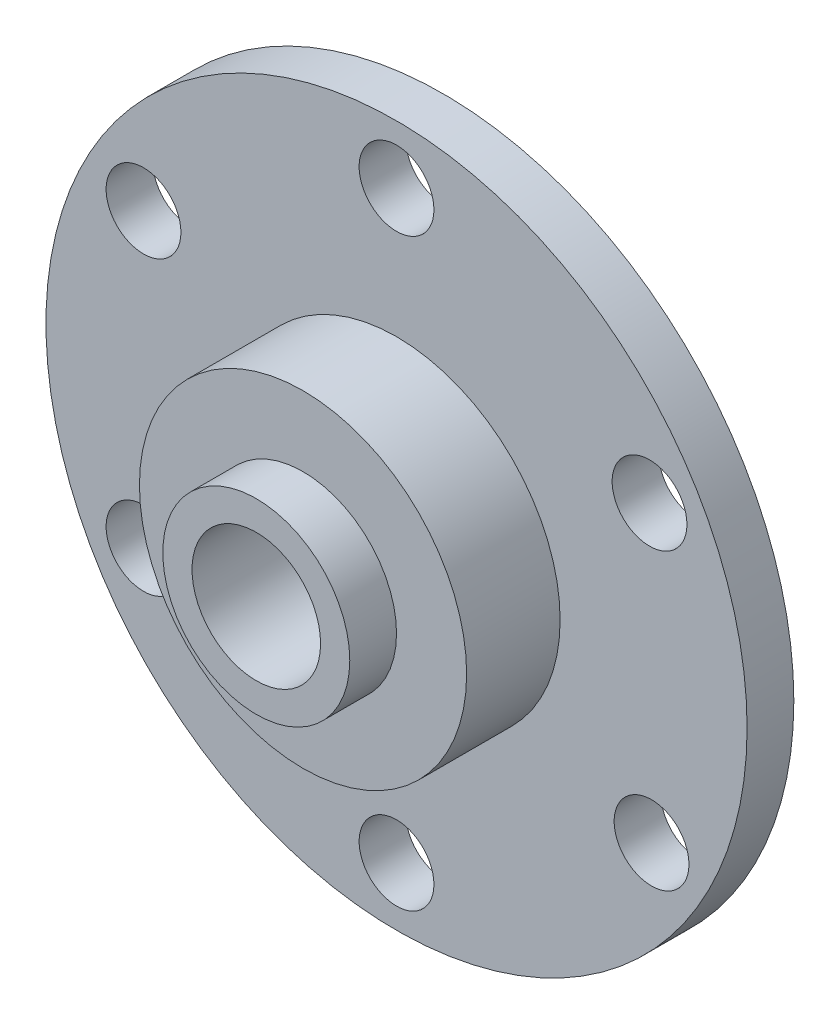
ISO-10303-21;
HEADER;
FILE_DESCRIPTION(('STEP AP214'),'2;1');
FILE_NAME('part.step','',(''),(''),'','','');
FILE_SCHEMA(('AUTOMOTIVE_DESIGN { 1 0 10303 214 1 1 1 1 }'));
ENDSEC;
DATA;
#1=APPLICATION_CONTEXT('core data for automotive mechanical design processes');
#2=APPLICATION_PROTOCOL_DEFINITION('international standard','automotive_design',2000,#1);
#3=PRODUCT_CONTEXT('',#1,'mechanical');
#4=PRODUCT('Part','Part','',(#3));
#5=PRODUCT_RELATED_PRODUCT_CATEGORY('part','',(#4));
#6=PRODUCT_DEFINITION_FORMATION('','',#4);
#7=PRODUCT_DEFINITION_CONTEXT('part definition',#1,'design');
#8=PRODUCT_DEFINITION('design','',#6,#7);
#9=PRODUCT_DEFINITION_SHAPE('','',#8);
#10=(LENGTH_UNIT() NAMED_UNIT(*) SI_UNIT(.MILLI.,.METRE.));
#11=(NAMED_UNIT(*) PLANE_ANGLE_UNIT() SI_UNIT($,.RADIAN.));
#12=(NAMED_UNIT(*) SI_UNIT($,.STERADIAN.) SOLID_ANGLE_UNIT());
#13=UNCERTAINTY_MEASURE_WITH_UNIT(LENGTH_MEASURE(1.E-05),#10,'distance_accuracy_value','');
#14=(GEOMETRIC_REPRESENTATION_CONTEXT(3) GLOBAL_UNCERTAINTY_ASSIGNED_CONTEXT((#13)) GLOBAL_UNIT_ASSIGNED_CONTEXT((#10,
#11,#12)) REPRESENTATION_CONTEXT('',''));
#15=CARTESIAN_POINT('',(0.,0.,0.));
#16=DIRECTION('',(0.,0.,1.));
#17=DIRECTION('',(1.,0.,0.));
#18=AXIS2_PLACEMENT_3D('',#15,#16,#17);
#19=CARTESIAN_POINT('',(0.,0.,6.));
#20=DIRECTION('',(0.,0.,1.));
#21=DIRECTION('',(1.,0.,0.));
#22=AXIS2_PLACEMENT_3D('',#19,#20,#21);
#23=PLANE('',#22);
#24=CARTESIAN_POINT('',(0.,0.,6.));
#25=DIRECTION('',(0.,0.,1.));
#26=DIRECTION('',(1.,0.,0.));
#27=AXIS2_PLACEMENT_3D('',#24,#25,#26);
#28=CIRCLE('',#27,7.);
#29=CARTESIAN_POINT('',(7.,0.,6.));
#30=VERTEX_POINT('',#29);
#31=EDGE_CURVE('E58',#30,#30,#28,.T.);
#32=ORIENTED_EDGE('',*,*,#31,.T.);
#33=EDGE_LOOP('',(#32));
#34=FACE_BOUND('',#33,.T.);
#35=CARTESIAN_POINT('',(0.,0.,6.));
#36=DIRECTION('',(0.,0.,1.));
#37=DIRECTION('',(1.,0.,0.));
#38=AXIS2_PLACEMENT_3D('',#35,#36,#37);
#39=CIRCLE('',#38,4.);
#40=CARTESIAN_POINT('',(4.,0.,6.));
#41=VERTEX_POINT('',#40);
#42=EDGE_CURVE('E120',#41,#41,#39,.T.);
#43=ORIENTED_EDGE('',*,*,#42,.F.);
#44=EDGE_LOOP('',(#43));
#45=FACE_BOUND('',#44,.T.);
#46=ADVANCED_FACE('F37',(#34,#45),#23,.T.);
#47=CARTESIAN_POINT('',(0.,0.,2.));
#48=DIRECTION('',(0.,0.,1.));
#49=DIRECTION('',(1.,0.,0.));
#50=AXIS2_PLACEMENT_3D('',#47,#48,#49);
#51=PLANE('',#50);
#52=CARTESIAN_POINT('',(0.,0.,2.));
#53=DIRECTION('',(0.,0.,1.));
#54=DIRECTION('',(1.,0.,0.));
#55=AXIS2_PLACEMENT_3D('',#52,#53,#54);
#56=CIRCLE('',#55,15.);
#57=CARTESIAN_POINT('',(15.,0.,2.));
#58=VERTEX_POINT('',#57);
#59=EDGE_CURVE('E10',#58,#58,#56,.T.);
#60=ORIENTED_EDGE('',*,*,#59,.T.);
#61=EDGE_LOOP('',(#60));
#62=FACE_BOUND('',#61,.T.);
#63=CARTESIAN_POINT('',(0.,12.5,2.));
#64=DIRECTION('',(0.,0.,1.));
#65=DIRECTION('',(1.,0.,0.));
#66=AXIS2_PLACEMENT_3D('',#63,#64,#65);
#67=CIRCLE('',#66,1.6);
#68=CARTESIAN_POINT('',(1.6,12.5,2.));
#69=VERTEX_POINT('',#68);
#70=EDGE_CURVE('E45',#69,#69,#67,.T.);
#71=ORIENTED_EDGE('',*,*,#70,.F.);
#72=EDGE_LOOP('',(#71));
#73=FACE_BOUND('',#72,.T.);
#74=CARTESIAN_POINT('',(-10.8253175473054,6.2500000000001,2.));
#75=DIRECTION('',(0.,0.,1.));
#76=DIRECTION('',(1.,0.,0.));
#77=AXIS2_PLACEMENT_3D('',#74,#75,#76);
#78=CIRCLE('',#77,1.60000000000001);
#79=CARTESIAN_POINT('',(-9.22531754730542,6.2500000000001,2.));
#80=VERTEX_POINT('',#79);
#81=EDGE_CURVE('E50',#80,#80,#78,.T.);
#82=ORIENTED_EDGE('',*,*,#81,.F.);
#83=EDGE_LOOP('',(#82));
#84=FACE_BOUND('',#83,.T.);
#85=CARTESIAN_POINT('',(-10.8253175473055,-6.25000000000001,2.));
#86=DIRECTION('',(0.,0.,1.));
#87=DIRECTION('',(1.,0.,0.));
#88=AXIS2_PLACEMENT_3D('',#85,#86,#87);
#89=CIRCLE('',#88,1.6);
#90=CARTESIAN_POINT('',(-9.22531754730548,-6.25000000000001,2.));
#91=VERTEX_POINT('',#90);
#92=EDGE_CURVE('E94',#91,#91,#89,.T.);
#93=ORIENTED_EDGE('',*,*,#92,.F.);
#94=EDGE_LOOP('',(#93));
#95=FACE_BOUND('',#94,.T.);
#96=CARTESIAN_POINT('',(0.,-12.5,2.));
#97=DIRECTION('',(0.,0.,1.));
#98=DIRECTION('',(1.,0.,0.));
#99=AXIS2_PLACEMENT_3D('',#96,#97,#98);
#100=CIRCLE('',#99,1.6);
#101=CARTESIAN_POINT('',(1.6,-12.5,2.));
#102=VERTEX_POINT('',#101);
#103=EDGE_CURVE('E86',#102,#102,#100,.T.);
#104=ORIENTED_EDGE('',*,*,#103,.F.);
#105=EDGE_LOOP('',(#104));
#106=FACE_BOUND('',#105,.T.);
#107=CARTESIAN_POINT('',(10.9119200876839,-6.30000000000011,2.));
#108=DIRECTION('',(0.,0.,1.));
#109=DIRECTION('',(1.,0.,0.));
#110=AXIS2_PLACEMENT_3D('',#107,#108,#109);
#111=CIRCLE('',#110,1.6);
#112=CARTESIAN_POINT('',(12.5119200876839,-6.30000000000011,2.));
#113=VERTEX_POINT('',#112);
#114=EDGE_CURVE('E81',#113,#113,#111,.T.);
#115=ORIENTED_EDGE('',*,*,#114,.F.);
#116=EDGE_LOOP('',(#115));
#117=FACE_BOUND('',#116,.T.);
#118=CARTESIAN_POINT('',(10.8253175473055,6.25000000000002,2.));
#119=DIRECTION('',(0.,0.,1.));
#120=DIRECTION('',(1.,0.,0.));
#121=AXIS2_PLACEMENT_3D('',#118,#119,#120);
#122=CIRCLE('',#121,1.6);
#123=CARTESIAN_POINT('',(12.4253175473055,6.25000000000002,2.));
#124=VERTEX_POINT('',#123);
#125=EDGE_CURVE('E77',#124,#124,#122,.T.);
#126=ORIENTED_EDGE('',*,*,#125,.F.);
#127=EDGE_LOOP('',(#126));
#128=FACE_BOUND('',#127,.T.);
#129=CARTESIAN_POINT('',(0.,0.,2.));
#130=DIRECTION('',(0.,0.,1.));
#131=DIRECTION('',(1.,0.,0.));
#132=AXIS2_PLACEMENT_3D('',#129,#130,#131);
#133=CIRCLE('',#132,7.);
#134=CARTESIAN_POINT('',(7.,0.,2.));
#135=VERTEX_POINT('',#134);
#136=EDGE_CURVE('E89',#135,#135,#133,.T.);
#137=ORIENTED_EDGE('',*,*,#136,.F.);
#138=EDGE_LOOP('',(#137));
#139=FACE_BOUND('',#138,.T.);
#140=ADVANCED_FACE('F102',(#62,#73,#84,#95,#106,#117,#128,#139),#51,.T.);
#141=CARTESIAN_POINT('',(0.,12.5,2.));
#142=DIRECTION('',(0.,0.,-1.));
#143=DIRECTION('',(-1.,0.,0.));
#144=AXIS2_PLACEMENT_3D('',#141,#142,#143);
#145=CYLINDRICAL_SURFACE('',#144,1.6);
#146=ORIENTED_EDGE('',*,*,#70,.T.);
#147=EDGE_LOOP('',(#146));
#148=FACE_BOUND('',#147,.T.);
#149=CARTESIAN_POINT('',(0.,12.5,0.));
#150=DIRECTION('',(0.,0.,1.));
#151=DIRECTION('',(1.,0.,0.));
#152=AXIS2_PLACEMENT_3D('',#149,#150,#151);
#153=CIRCLE('',#152,1.6);
#154=CARTESIAN_POINT('',(1.6,12.5,0.));
#155=VERTEX_POINT('',#154);
#156=EDGE_CURVE('E72',#155,#155,#153,.T.);
#157=ORIENTED_EDGE('',*,*,#156,.F.);
#158=EDGE_LOOP('',(#157));
#159=FACE_BOUND('',#158,.T.);
#160=ADVANCED_FACE('F105',(#148,#159),#145,.F.);
#161=CARTESIAN_POINT('',(-10.8253175473054,6.2500000000001,2.));
#162=DIRECTION('',(0.,0.,-1.));
#163=DIRECTION('',(-1.,0.,0.));
#164=AXIS2_PLACEMENT_3D('',#161,#162,#163);
#165=CYLINDRICAL_SURFACE('',#164,1.60000000000001);
#166=ORIENTED_EDGE('',*,*,#81,.T.);
#167=EDGE_LOOP('',(#166));
#168=FACE_BOUND('',#167,.T.);
#169=CARTESIAN_POINT('',(-10.8253175473054,6.2500000000001,0.));
#170=DIRECTION('',(0.,0.,1.));
#171=DIRECTION('',(1.,0.,0.));
#172=AXIS2_PLACEMENT_3D('',#169,#170,#171);
#173=CIRCLE('',#172,1.60000000000001);
#174=CARTESIAN_POINT('',(-9.22531754730542,6.2500000000001,0.));
#175=VERTEX_POINT('',#174);
#176=EDGE_CURVE('E70',#175,#175,#173,.T.);
#177=ORIENTED_EDGE('',*,*,#176,.F.);
#178=EDGE_LOOP('',(#177));
#179=FACE_BOUND('',#178,.T.);
#180=ADVANCED_FACE('F99',(#168,#179),#165,.F.);
#181=CARTESIAN_POINT('',(-10.8253175473055,-6.25000000000001,2.));
#182=DIRECTION('',(0.,0.,-1.));
#183=DIRECTION('',(-1.,0.,0.));
#184=AXIS2_PLACEMENT_3D('',#181,#182,#183);
#185=CYLINDRICAL_SURFACE('',#184,1.6);
#186=ORIENTED_EDGE('',*,*,#92,.T.);
#187=EDGE_LOOP('',(#186));
#188=FACE_BOUND('',#187,.T.);
#189=CARTESIAN_POINT('',(-10.8253175473055,-6.25000000000001,0.));
#190=DIRECTION('',(0.,0.,1.));
#191=DIRECTION('',(1.,0.,0.));
#192=AXIS2_PLACEMENT_3D('',#189,#190,#191);
#193=CIRCLE('',#192,1.6);
#194=CARTESIAN_POINT('',(-9.22531754730548,-6.25000000000001,0.));
#195=VERTEX_POINT('',#194);
#196=EDGE_CURVE('E67',#195,#195,#193,.T.);
#197=ORIENTED_EDGE('',*,*,#196,.F.);
#198=EDGE_LOOP('',(#197));
#199=FACE_BOUND('',#198,.T.);
#200=ADVANCED_FACE('F165',(#188,#199),#185,.F.);
#201=CARTESIAN_POINT('',(0.,-12.5,2.));
#202=DIRECTION('',(0.,0.,-1.));
#203=DIRECTION('',(-1.,0.,0.));
#204=AXIS2_PLACEMENT_3D('',#201,#202,#203);
#205=CYLINDRICAL_SURFACE('',#204,1.6);
#206=ORIENTED_EDGE('',*,*,#103,.T.);
#207=EDGE_LOOP('',(#206));
#208=FACE_BOUND('',#207,.T.);
#209=CARTESIAN_POINT('',(0.,-12.5,0.));
#210=DIRECTION('',(0.,0.,1.));
#211=DIRECTION('',(1.,0.,0.));
#212=AXIS2_PLACEMENT_3D('',#209,#210,#211);
#213=CIRCLE('',#212,1.6);
#214=CARTESIAN_POINT('',(1.6,-12.5,0.));
#215=VERTEX_POINT('',#214);
#216=EDGE_CURVE('E64',#215,#215,#213,.T.);
#217=ORIENTED_EDGE('',*,*,#216,.F.);
#218=EDGE_LOOP('',(#217));
#219=FACE_BOUND('',#218,.T.);
#220=ADVANCED_FACE('F168',(#208,#219),#205,.F.);
#221=CARTESIAN_POINT('',(10.9119200876839,-6.30000000000011,2.));
#222=DIRECTION('',(0.,0.,-1.));
#223=DIRECTION('',(-1.,0.,0.));
#224=AXIS2_PLACEMENT_3D('',#221,#222,#223);
#225=CYLINDRICAL_SURFACE('',#224,1.6);
#226=ORIENTED_EDGE('',*,*,#114,.T.);
#227=EDGE_LOOP('',(#226));
#228=FACE_BOUND('',#227,.T.);
#229=CARTESIAN_POINT('',(10.9119200876839,-6.30000000000011,0.));
#230=DIRECTION('',(0.,0.,1.));
#231=DIRECTION('',(1.,0.,0.));
#232=AXIS2_PLACEMENT_3D('',#229,#230,#231);
#233=CIRCLE('',#232,1.6);
#234=CARTESIAN_POINT('',(12.5119200876839,-6.30000000000011,0.));
#235=VERTEX_POINT('',#234);
#236=EDGE_CURVE('E61',#235,#235,#233,.T.);
#237=ORIENTED_EDGE('',*,*,#236,.F.);
#238=EDGE_LOOP('',(#237));
#239=FACE_BOUND('',#238,.T.);
#240=ADVANCED_FACE('F172',(#228,#239),#225,.F.);
#241=CARTESIAN_POINT('',(10.8253175473055,6.25000000000002,2.));
#242=DIRECTION('',(0.,0.,-1.));
#243=DIRECTION('',(-1.,0.,0.));
#244=AXIS2_PLACEMENT_3D('',#241,#242,#243);
#245=CYLINDRICAL_SURFACE('',#244,1.6);
#246=ORIENTED_EDGE('',*,*,#125,.T.);
#247=EDGE_LOOP('',(#246));
#248=FACE_BOUND('',#247,.T.);
#249=CARTESIAN_POINT('',(10.8253175473055,6.25000000000002,0.));
#250=DIRECTION('',(0.,0.,1.));
#251=DIRECTION('',(1.,0.,0.));
#252=AXIS2_PLACEMENT_3D('',#249,#250,#251);
#253=CIRCLE('',#252,1.6);
#254=CARTESIAN_POINT('',(12.4253175473055,6.25000000000002,0.));
#255=VERTEX_POINT('',#254);
#256=EDGE_CURVE('E57',#255,#255,#253,.T.);
#257=ORIENTED_EDGE('',*,*,#256,.F.);
#258=EDGE_LOOP('',(#257));
#259=FACE_BOUND('',#258,.T.);
#260=ADVANCED_FACE('F175',(#248,#259),#245,.F.);
#261=CARTESIAN_POINT('',(0.,0.,2.));
#262=DIRECTION('',(0.,0.,-1.));
#263=DIRECTION('',(-1.,0.,0.));
#264=AXIS2_PLACEMENT_3D('',#261,#262,#263);
#265=CYLINDRICAL_SURFACE('',#264,2.75);
#266=CARTESIAN_POINT('',(0.,0.,0.));
#267=DIRECTION('',(0.,0.,1.));
#268=DIRECTION('',(1.,0.,0.));
#269=AXIS2_PLACEMENT_3D('',#266,#267,#268);
#270=CIRCLE('',#269,2.75);
#271=CARTESIAN_POINT('',(2.75,0.,0.));
#272=VERTEX_POINT('',#271);
#273=EDGE_CURVE('E54',#272,#272,#270,.T.);
#274=ORIENTED_EDGE('',*,*,#273,.F.);
#275=EDGE_LOOP('',(#274));
#276=FACE_BOUND('',#275,.T.);
#277=CARTESIAN_POINT('',(0.,0.,8.));
#278=DIRECTION('',(0.,0.,1.));
#279=DIRECTION('',(1.,0.,0.));
#280=AXIS2_PLACEMENT_3D('',#277,#278,#279);
#281=CIRCLE('',#280,2.75);
#282=CARTESIAN_POINT('',(2.75,0.,8.));
#283=VERTEX_POINT('',#282);
#284=EDGE_CURVE('E125',#283,#283,#281,.T.);
#285=ORIENTED_EDGE('',*,*,#284,.T.);
#286=EDGE_LOOP('',(#285));
#287=FACE_BOUND('',#286,.T.);
#288=ADVANCED_FACE('F39',(#276,#287),#265,.F.);
#289=CARTESIAN_POINT('',(0.,0.,2.));
#290=DIRECTION('',(0.,0.,-1.));
#291=DIRECTION('',(-1.,0.,0.));
#292=AXIS2_PLACEMENT_3D('',#289,#290,#291);
#293=CYLINDRICAL_SURFACE('',#292,15.);
#294=ORIENTED_EDGE('',*,*,#59,.F.);
#295=EDGE_LOOP('',(#294));
#296=FACE_BOUND('',#295,.T.);
#297=CARTESIAN_POINT('',(0.,0.,0.));
#298=DIRECTION('',(0.,0.,1.));
#299=DIRECTION('',(1.,0.,0.));
#300=AXIS2_PLACEMENT_3D('',#297,#298,#299);
#301=CIRCLE('',#300,15.);
#302=CARTESIAN_POINT('',(15.,0.,0.));
#303=VERTEX_POINT('',#302);
#304=EDGE_CURVE('E41',#303,#303,#301,.T.);
#305=ORIENTED_EDGE('',*,*,#304,.T.);
#306=EDGE_LOOP('',(#305));
#307=FACE_BOUND('',#306,.T.);
#308=ADVANCED_FACE('F155',(#296,#307),#293,.T.);
#309=CARTESIAN_POINT('',(0.,0.,0.));
#310=DIRECTION('',(0.,0.,1.));
#311=DIRECTION('',(1.,0.,0.));
#312=AXIS2_PLACEMENT_3D('',#309,#310,#311);
#313=PLANE('',#312);
#314=ORIENTED_EDGE('',*,*,#273,.T.);
#315=EDGE_LOOP('',(#314));
#316=FACE_BOUND('',#315,.T.);
#317=ORIENTED_EDGE('',*,*,#256,.T.);
#318=EDGE_LOOP('',(#317));
#319=FACE_BOUND('',#318,.T.);
#320=ORIENTED_EDGE('',*,*,#236,.T.);
#321=EDGE_LOOP('',(#320));
#322=FACE_BOUND('',#321,.T.);
#323=ORIENTED_EDGE('',*,*,#216,.T.);
#324=EDGE_LOOP('',(#323));
#325=FACE_BOUND('',#324,.T.);
#326=ORIENTED_EDGE('',*,*,#196,.T.);
#327=EDGE_LOOP('',(#326));
#328=FACE_BOUND('',#327,.T.);
#329=ORIENTED_EDGE('',*,*,#176,.T.);
#330=EDGE_LOOP('',(#329));
#331=FACE_BOUND('',#330,.T.);
#332=ORIENTED_EDGE('',*,*,#156,.T.);
#333=EDGE_LOOP('',(#332));
#334=FACE_BOUND('',#333,.T.);
#335=ORIENTED_EDGE('',*,*,#304,.F.);
#336=EDGE_LOOP('',(#335));
#337=FACE_BOUND('',#336,.T.);
#338=ADVANCED_FACE('F143',(#316,#319,#322,#325,#328,#331,#334,#337),#313,.F.);
#339=CARTESIAN_POINT('',(0.,0.,6.));
#340=DIRECTION('',(0.,0.,-1.));
#341=DIRECTION('',(-1.,0.,0.));
#342=AXIS2_PLACEMENT_3D('',#339,#340,#341);
#343=CYLINDRICAL_SURFACE('',#342,7.);
#344=ORIENTED_EDGE('',*,*,#31,.F.);
#345=EDGE_LOOP('',(#344));
#346=FACE_BOUND('',#345,.T.);
#347=ORIENTED_EDGE('',*,*,#136,.T.);
#348=EDGE_LOOP('',(#347));
#349=FACE_BOUND('',#348,.T.);
#350=ADVANCED_FACE('F135',(#346,#349),#343,.T.);
#351=CARTESIAN_POINT('',(0.,0.,8.));
#352=DIRECTION('',(0.,0.,1.));
#353=DIRECTION('',(1.,0.,0.));
#354=AXIS2_PLACEMENT_3D('',#351,#352,#353);
#355=PLANE('',#354);
#356=CARTESIAN_POINT('',(0.,0.,8.));
#357=DIRECTION('',(0.,0.,1.));
#358=DIRECTION('',(1.,0.,0.));
#359=AXIS2_PLACEMENT_3D('',#356,#357,#358);
#360=CIRCLE('',#359,4.);
#361=CARTESIAN_POINT('',(4.,0.,8.));
#362=VERTEX_POINT('',#361);
#363=EDGE_CURVE('E117',#362,#362,#360,.T.);
#364=ORIENTED_EDGE('',*,*,#363,.T.);
#365=EDGE_LOOP('',(#364));
#366=FACE_BOUND('',#365,.T.);
#367=ORIENTED_EDGE('',*,*,#284,.F.);
#368=EDGE_LOOP('',(#367));
#369=FACE_BOUND('',#368,.T.);
#370=ADVANCED_FACE('F132',(#366,#369),#355,.T.);
#371=CARTESIAN_POINT('',(0.,0.,8.));
#372=DIRECTION('',(0.,0.,-1.));
#373=DIRECTION('',(-1.,0.,0.));
#374=AXIS2_PLACEMENT_3D('',#371,#372,#373);
#375=CYLINDRICAL_SURFACE('',#374,4.);
#376=ORIENTED_EDGE('',*,*,#363,.F.);
#377=EDGE_LOOP('',(#376));
#378=FACE_BOUND('',#377,.T.);
#379=ORIENTED_EDGE('',*,*,#42,.T.);
#380=EDGE_LOOP('',(#379));
#381=FACE_BOUND('',#380,.T.);
#382=ADVANCED_FACE('F134',(#378,#381),#375,.T.);
#383=CLOSED_SHELL('',(#46,#140,#160,#180,#200,#220,#240,#260,#288,#308,#338,#350,#370,#382));
#384=MANIFOLD_SOLID_BREP('B2',#383);
#385=ADVANCED_BREP_SHAPE_REPRESENTATION('',(#18,#384),#14);
#386=SHAPE_DEFINITION_REPRESENTATION(#9,#385);
ENDSEC;
END-ISO-10303-21;
